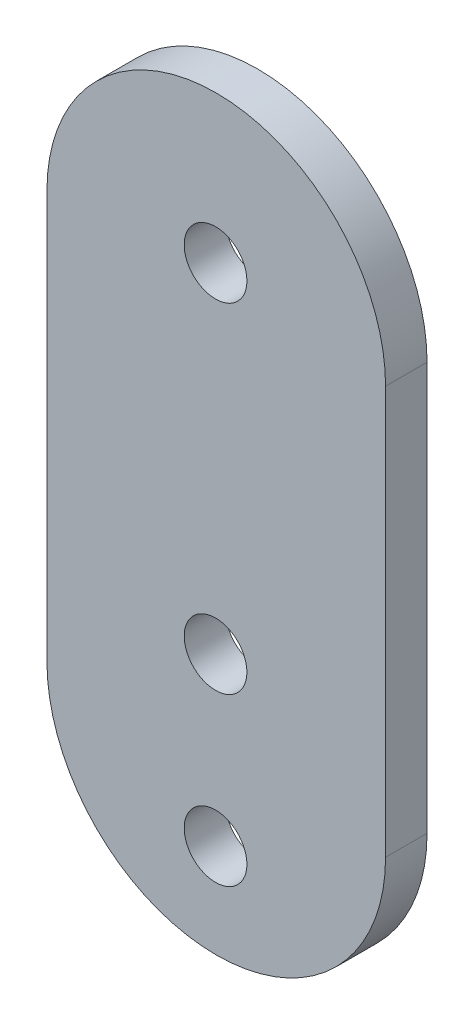
ISO-10303-21;
HEADER;
FILE_DESCRIPTION(('STEP AP214'),'2;1');
FILE_NAME('part.step','',(''),(''),'','','');
FILE_SCHEMA(('AUTOMOTIVE_DESIGN { 1 0 10303 214 1 1 1 1 }'));
ENDSEC;
DATA;
#1=APPLICATION_CONTEXT('core data for automotive mechanical design processes');
#2=APPLICATION_PROTOCOL_DEFINITION('international standard','automotive_design',2000,#1);
#3=PRODUCT_CONTEXT('',#1,'mechanical');
#4=PRODUCT('Part','Part','',(#3));
#5=PRODUCT_RELATED_PRODUCT_CATEGORY('part','',(#4));
#6=PRODUCT_DEFINITION_FORMATION('','',#4);
#7=PRODUCT_DEFINITION_CONTEXT('part definition',#1,'design');
#8=PRODUCT_DEFINITION('design','',#6,#7);
#9=PRODUCT_DEFINITION_SHAPE('','',#8);
#10=(LENGTH_UNIT() NAMED_UNIT(*) SI_UNIT(.MILLI.,.METRE.));
#11=(NAMED_UNIT(*) PLANE_ANGLE_UNIT() SI_UNIT($,.RADIAN.));
#12=(NAMED_UNIT(*) SI_UNIT($,.STERADIAN.) SOLID_ANGLE_UNIT());
#13=UNCERTAINTY_MEASURE_WITH_UNIT(LENGTH_MEASURE(1.E-05),#10,'distance_accuracy_value','');
#14=(GEOMETRIC_REPRESENTATION_CONTEXT(3) GLOBAL_UNCERTAINTY_ASSIGNED_CONTEXT((#13)) GLOBAL_UNIT_ASSIGNED_CONTEXT((#10,
#11,#12)) REPRESENTATION_CONTEXT('',''));
#15=CARTESIAN_POINT('',(0.,0.,0.));
#16=DIRECTION('',(0.,0.,1.));
#17=DIRECTION('',(1.,0.,0.));
#18=AXIS2_PLACEMENT_3D('',#15,#16,#17);
#19=CARTESIAN_POINT('',(-18.5270221389735,39.2454351088365,2.778125));
#20=DIRECTION('',(0.,0.,-1.));
#21=DIRECTION('',(-1.,0.,0.));
#22=AXIS2_PLACEMENT_3D('',#19,#20,#21);
#23=CYLINDRICAL_SURFACE('',#22,11.3393248262221);
#24=CARTESIAN_POINT('',(-18.5270221389735,39.2454351088365,0.));
#25=DIRECTION('',(0.,0.,1.));
#26=DIRECTION('',(1.,0.,0.));
#27=AXIS2_PLACEMENT_3D('',#24,#25,#26);
#28=CIRCLE('',#27,11.3393248262221);
#29=CARTESIAN_POINT('',(-7.18769731275138,39.2454351088365,0.));
#30=VERTEX_POINT('',#29);
#31=CARTESIAN_POINT('',(-29.8663469651956,39.2454351088365,0.));
#32=VERTEX_POINT('',#31);
#33=EDGE_CURVE('E99',#30,#32,#28,.T.);
#34=ORIENTED_EDGE('',*,*,#33,.T.);
#35=DIRECTION('',(0.,0.,-1.));
#36=VECTOR('',#35,1.);
#37=CARTESIAN_POINT('',(-29.8663469651956,39.2454351088365,2.778125));
#38=LINE('',#37,#36);
#39=CARTESIAN_POINT('',(-29.8663469651956,39.2454351088365,2.778125));
#40=VERTEX_POINT('',#39);
#41=EDGE_CURVE('E11',#40,#32,#38,.T.);
#42=ORIENTED_EDGE('',*,*,#41,.F.);
#43=CARTESIAN_POINT('',(-18.5270221389735,39.2454351088365,2.778125));
#44=DIRECTION('',(0.,0.,1.));
#45=DIRECTION('',(1.,0.,0.));
#46=AXIS2_PLACEMENT_3D('',#43,#44,#45);
#47=CIRCLE('',#46,11.3393248262221);
#48=CARTESIAN_POINT('',(-7.18769731275138,39.2454351088365,2.778125));
#49=VERTEX_POINT('',#48);
#50=EDGE_CURVE('E86',#49,#40,#47,.T.);
#51=ORIENTED_EDGE('',*,*,#50,.F.);
#52=DIRECTION('',(0.,0.,-1.));
#53=VECTOR('',#52,1.);
#54=CARTESIAN_POINT('',(-7.18769731275138,39.2454351088365,2.778125));
#55=LINE('',#54,#53);
#56=EDGE_CURVE('E95',#49,#30,#55,.T.);
#57=ORIENTED_EDGE('',*,*,#56,.T.);
#58=EDGE_LOOP('',(#34,#42,#51,#57));
#59=FACE_BOUND('',#58,.T.);
#60=ADVANCED_FACE('F33',(#59),#23,.T.);
#61=CARTESIAN_POINT('',(-29.8663469651956,39.2454351088365,2.778125));
#62=DIRECTION('',(1.,0.,0.));
#63=DIRECTION('',(0.,0.,-1.));
#64=AXIS2_PLACEMENT_3D('',#61,#62,#63);
#65=PLANE('',#64);
#66=DIRECTION('',(0.,-1.,0.));
#67=VECTOR('',#66,1.);
#68=CARTESIAN_POINT('',(-29.8663469651956,39.2454351088365,0.));
#69=LINE('',#68,#67);
#70=CARTESIAN_POINT('',(-29.8663469651956,11.9240847612808,0.));
#71=VERTEX_POINT('',#70);
#72=EDGE_CURVE('E90',#32,#71,#69,.T.);
#73=ORIENTED_EDGE('',*,*,#72,.T.);
#74=DIRECTION('',(0.,0.,-1.));
#75=VECTOR('',#74,1.);
#76=CARTESIAN_POINT('',(-29.8663469651956,11.9240847612808,2.778125));
#77=LINE('',#76,#75);
#78=CARTESIAN_POINT('',(-29.8663469651956,11.9240847612808,2.778125));
#79=VERTEX_POINT('',#78);
#80=EDGE_CURVE('E42',#79,#71,#77,.T.);
#81=ORIENTED_EDGE('',*,*,#80,.F.);
#82=DIRECTION('',(0.,-1.,0.));
#83=VECTOR('',#82,1.);
#84=CARTESIAN_POINT('',(-29.8663469651956,39.2454351088365,2.778125));
#85=LINE('',#84,#83);
#86=EDGE_CURVE('E81',#40,#79,#85,.T.);
#87=ORIENTED_EDGE('',*,*,#86,.F.);
#88=ORIENTED_EDGE('',*,*,#41,.T.);
#89=EDGE_LOOP('',(#73,#81,#87,#88));
#90=FACE_BOUND('',#89,.T.);
#91=ADVANCED_FACE('F89',(#90),#65,.F.);
#92=CARTESIAN_POINT('',(-18.5270221389735,11.9240847612808,2.778125));
#93=DIRECTION('',(0.,0.,-1.));
#94=DIRECTION('',(-1.,0.,0.));
#95=AXIS2_PLACEMENT_3D('',#92,#93,#94);
#96=CYLINDRICAL_SURFACE('',#95,11.3393248262221);
#97=CARTESIAN_POINT('',(-18.5270221389735,11.9240847612808,0.));
#98=DIRECTION('',(0.,0.,1.));
#99=DIRECTION('',(1.,0.,0.));
#100=AXIS2_PLACEMENT_3D('',#97,#98,#99);
#101=CIRCLE('',#100,11.3393248262221);
#102=CARTESIAN_POINT('',(-7.18769731275138,11.9240847612808,0.));
#103=VERTEX_POINT('',#102);
#104=EDGE_CURVE('E68',#71,#103,#101,.T.);
#105=ORIENTED_EDGE('',*,*,#104,.T.);
#106=DIRECTION('',(0.,0.,-1.));
#107=VECTOR('',#106,1.);
#108=CARTESIAN_POINT('',(-7.18769731275138,11.9240847612808,2.778125));
#109=LINE('',#108,#107);
#110=CARTESIAN_POINT('',(-7.18769731275138,11.9240847612808,2.778125));
#111=VERTEX_POINT('',#110);
#112=EDGE_CURVE('E91',#111,#103,#109,.T.);
#113=ORIENTED_EDGE('',*,*,#112,.F.);
#114=CARTESIAN_POINT('',(-18.5270221389735,11.9240847612808,2.778125));
#115=DIRECTION('',(0.,0.,1.));
#116=DIRECTION('',(1.,0.,0.));
#117=AXIS2_PLACEMENT_3D('',#114,#115,#116);
#118=CIRCLE('',#117,11.3393248262221);
#119=EDGE_CURVE('E84',#79,#111,#118,.T.);
#120=ORIENTED_EDGE('',*,*,#119,.F.);
#121=ORIENTED_EDGE('',*,*,#80,.T.);
#122=EDGE_LOOP('',(#105,#113,#120,#121));
#123=FACE_BOUND('',#122,.T.);
#124=ADVANCED_FACE('F93',(#123),#96,.T.);
#125=CARTESIAN_POINT('',(-7.18769731275138,39.2454351088365,2.778125));
#126=DIRECTION('',(-1.,0.,0.));
#127=DIRECTION('',(0.,0.,1.));
#128=AXIS2_PLACEMENT_3D('',#125,#126,#127);
#129=PLANE('',#128);
#130=DIRECTION('',(0.,1.,0.));
#131=VECTOR('',#130,1.);
#132=CARTESIAN_POINT('',(-7.18769731275138,39.2454351088365,0.));
#133=LINE('',#132,#131);
#134=EDGE_CURVE('E74',#103,#30,#133,.T.);
#135=ORIENTED_EDGE('',*,*,#134,.T.);
#136=ORIENTED_EDGE('',*,*,#56,.F.);
#137=DIRECTION('',(0.,1.,0.));
#138=VECTOR('',#137,1.);
#139=CARTESIAN_POINT('',(-7.18769731275138,39.2454351088365,2.778125));
#140=LINE('',#139,#138);
#141=EDGE_CURVE('E51',#111,#49,#140,.T.);
#142=ORIENTED_EDGE('',*,*,#141,.F.);
#143=ORIENTED_EDGE('',*,*,#112,.T.);
#144=EDGE_LOOP('',(#135,#136,#142,#143));
#145=FACE_BOUND('',#144,.T.);
#146=ADVANCED_FACE('F146',(#145),#129,.F.);
#147=CARTESIAN_POINT('',(-18.5270221389735,39.2454351088365,2.778125));
#148=DIRECTION('',(0.,0.,1.));
#149=DIRECTION('',(1.,0.,0.));
#150=AXIS2_PLACEMENT_3D('',#147,#148,#149);
#151=PLANE('',#150);
#152=CARTESIAN_POINT('',(-18.5739733282233,6.87125141980882,2.778125));
#153=DIRECTION('',(0.,0.,1.));
#154=DIRECTION('',(1.,0.,0.));
#155=AXIS2_PLACEMENT_3D('',#152,#153,#154);
#156=CIRCLE('',#155,2.1);
#157=CARTESIAN_POINT('',(-16.4739733282233,6.87125141980882,2.778125));
#158=VERTEX_POINT('',#157);
#159=EDGE_CURVE('E110',#158,#158,#156,.T.);
#160=ORIENTED_EDGE('',*,*,#159,.F.);
#161=EDGE_LOOP('',(#160));
#162=FACE_BOUND('',#161,.T.);
#163=CARTESIAN_POINT('',(-18.5739733282233,18.0104491690281,2.778125));
#164=DIRECTION('',(0.,0.,1.));
#165=DIRECTION('',(1.,0.,0.));
#166=AXIS2_PLACEMENT_3D('',#163,#164,#165);
#167=CIRCLE('',#166,2.1);
#168=CARTESIAN_POINT('',(-16.4739733282233,18.0104491690281,2.778125));
#169=VERTEX_POINT('',#168);
#170=EDGE_CURVE('E212',#169,#169,#167,.T.);
#171=ORIENTED_EDGE('',*,*,#170,.F.);
#172=EDGE_LOOP('',(#171));
#173=FACE_BOUND('',#172,.T.);
#174=CARTESIAN_POINT('',(-18.5739733282233,40.7067491973457,2.778125));
#175=DIRECTION('',(0.,0.,1.));
#176=DIRECTION('',(1.,0.,0.));
#177=AXIS2_PLACEMENT_3D('',#174,#175,#176);
#178=CIRCLE('',#177,2.1);
#179=CARTESIAN_POINT('',(-16.4739733282233,40.7067491973457,2.778125));
#180=VERTEX_POINT('',#179);
#181=EDGE_CURVE('E215',#180,#180,#178,.T.);
#182=ORIENTED_EDGE('',*,*,#181,.F.);
#183=EDGE_LOOP('',(#182));
#184=FACE_BOUND('',#183,.T.);
#185=ORIENTED_EDGE('',*,*,#50,.T.);
#186=ORIENTED_EDGE('',*,*,#86,.T.);
#187=ORIENTED_EDGE('',*,*,#119,.T.);
#188=ORIENTED_EDGE('',*,*,#141,.T.);
#189=EDGE_LOOP('',(#185,#186,#187,#188));
#190=FACE_BOUND('',#189,.T.);
#191=ADVANCED_FACE('F82',(#162,#173,#184,#190),#151,.T.);
#192=CARTESIAN_POINT('',(-18.5270221389735,39.2454351088365,0.));
#193=DIRECTION('',(0.,0.,1.));
#194=DIRECTION('',(1.,0.,0.));
#195=AXIS2_PLACEMENT_3D('',#192,#193,#194);
#196=PLANE('',#195);
#197=CARTESIAN_POINT('',(-18.5739733282233,6.87125141980882,0.));
#198=DIRECTION('',(0.,0.,1.));
#199=DIRECTION('',(1.,0.,0.));
#200=AXIS2_PLACEMENT_3D('',#197,#198,#199);
#201=CIRCLE('',#200,2.1);
#202=CARTESIAN_POINT('',(-16.4739733282233,6.87125141980882,0.));
#203=VERTEX_POINT('',#202);
#204=EDGE_CURVE('E36',#203,#203,#201,.T.);
#205=ORIENTED_EDGE('',*,*,#204,.T.);
#206=EDGE_LOOP('',(#205));
#207=FACE_BOUND('',#206,.T.);
#208=CARTESIAN_POINT('',(-18.5739733282233,18.0104491690281,0.));
#209=DIRECTION('',(0.,0.,1.));
#210=DIRECTION('',(1.,0.,0.));
#211=AXIS2_PLACEMENT_3D('',#208,#209,#210);
#212=CIRCLE('',#211,2.1);
#213=CARTESIAN_POINT('',(-16.4739733282233,18.0104491690281,0.));
#214=VERTEX_POINT('',#213);
#215=EDGE_CURVE('E109',#214,#214,#212,.T.);
#216=ORIENTED_EDGE('',*,*,#215,.T.);
#217=EDGE_LOOP('',(#216));
#218=FACE_BOUND('',#217,.T.);
#219=CARTESIAN_POINT('',(-18.5739733282233,40.7067491973457,0.));
#220=DIRECTION('',(0.,0.,1.));
#221=DIRECTION('',(1.,0.,0.));
#222=AXIS2_PLACEMENT_3D('',#219,#220,#221);
#223=CIRCLE('',#222,2.1);
#224=CARTESIAN_POINT('',(-16.4739733282233,40.7067491973457,0.));
#225=VERTEX_POINT('',#224);
#226=EDGE_CURVE('E107',#225,#225,#223,.T.);
#227=ORIENTED_EDGE('',*,*,#226,.T.);
#228=EDGE_LOOP('',(#227));
#229=FACE_BOUND('',#228,.T.);
#230=ORIENTED_EDGE('',*,*,#33,.F.);
#231=ORIENTED_EDGE('',*,*,#134,.F.);
#232=ORIENTED_EDGE('',*,*,#104,.F.);
#233=ORIENTED_EDGE('',*,*,#72,.F.);
#234=EDGE_LOOP('',(#230,#231,#232,#233));
#235=FACE_BOUND('',#234,.T.);
#236=ADVANCED_FACE('F117',(#207,#218,#229,#235),#196,.F.);
#237=CARTESIAN_POINT('',(-18.5739733282233,40.7067491973457,-7.221875));
#238=DIRECTION('',(0.,0.,1.));
#239=DIRECTION('',(1.,0.,0.));
#240=AXIS2_PLACEMENT_3D('',#237,#238,#239);
#241=CYLINDRICAL_SURFACE('',#240,2.1);
#242=ORIENTED_EDGE('',*,*,#181,.T.);
#243=EDGE_LOOP('',(#242));
#244=FACE_BOUND('',#243,.T.);
#245=ORIENTED_EDGE('',*,*,#226,.F.);
#246=EDGE_LOOP('',(#245));
#247=FACE_BOUND('',#246,.T.);
#248=ADVANCED_FACE('F127',(#244,#247),#241,.F.);
#249=CARTESIAN_POINT('',(-18.5739733282233,18.0104491690281,-7.221875));
#250=DIRECTION('',(0.,0.,1.));
#251=DIRECTION('',(1.,0.,0.));
#252=AXIS2_PLACEMENT_3D('',#249,#250,#251);
#253=CYLINDRICAL_SURFACE('',#252,2.1);
#254=ORIENTED_EDGE('',*,*,#170,.T.);
#255=EDGE_LOOP('',(#254));
#256=FACE_BOUND('',#255,.T.);
#257=ORIENTED_EDGE('',*,*,#215,.F.);
#258=EDGE_LOOP('',(#257));
#259=FACE_BOUND('',#258,.T.);
#260=ADVANCED_FACE('F121',(#256,#259),#253,.F.);
#261=CARTESIAN_POINT('',(-18.5739733282233,6.87125141980882,-7.221875));
#262=DIRECTION('',(0.,0.,1.));
#263=DIRECTION('',(1.,0.,0.));
#264=AXIS2_PLACEMENT_3D('',#261,#262,#263);
#265=CYLINDRICAL_SURFACE('',#264,2.1);
#266=ORIENTED_EDGE('',*,*,#159,.T.);
#267=EDGE_LOOP('',(#266));
#268=FACE_BOUND('',#267,.T.);
#269=ORIENTED_EDGE('',*,*,#204,.F.);
#270=EDGE_LOOP('',(#269));
#271=FACE_BOUND('',#270,.T.);
#272=ADVANCED_FACE('F119',(#268,#271),#265,.F.);
#273=CLOSED_SHELL('',(#60,#91,#124,#146,#191,#236,#248,#260,#272));
#274=MANIFOLD_SOLID_BREP('B2',#273);
#275=ADVANCED_BREP_SHAPE_REPRESENTATION('',(#18,#274),#14);
#276=SHAPE_DEFINITION_REPRESENTATION(#9,#275);
ENDSEC;
END-ISO-10303-21;
